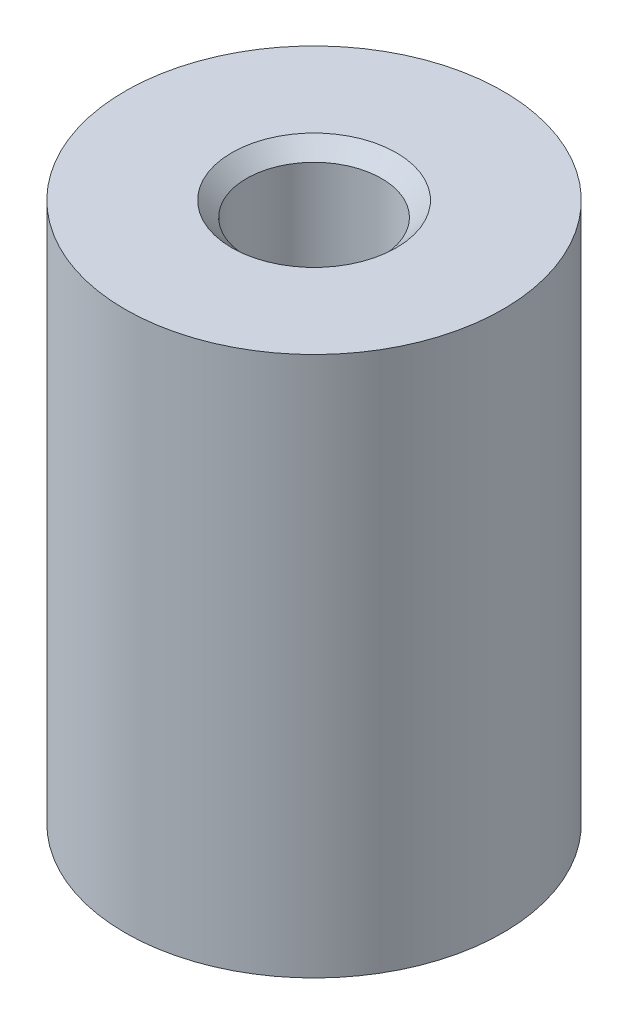
ISO-10303-21;
HEADER;
FILE_DESCRIPTION(('STEP AP214'),'2;1');
FILE_NAME('part.step','',(''),(''),'','','');
FILE_SCHEMA(('AUTOMOTIVE_DESIGN { 1 0 10303 214 1 1 1 1 }'));
ENDSEC;
DATA;
#1=APPLICATION_CONTEXT('core data for automotive mechanical design processes');
#2=APPLICATION_PROTOCOL_DEFINITION('international standard','automotive_design',2000,#1);
#3=PRODUCT_CONTEXT('',#1,'mechanical');
#4=PRODUCT('Part','Part','',(#3));
#5=PRODUCT_RELATED_PRODUCT_CATEGORY('part','',(#4));
#6=PRODUCT_DEFINITION_FORMATION('','',#4);
#7=PRODUCT_DEFINITION_CONTEXT('part definition',#1,'design');
#8=PRODUCT_DEFINITION('design','',#6,#7);
#9=PRODUCT_DEFINITION_SHAPE('','',#8);
#10=(LENGTH_UNIT() NAMED_UNIT(*) SI_UNIT(.MILLI.,.METRE.));
#11=(NAMED_UNIT(*) PLANE_ANGLE_UNIT() SI_UNIT($,.RADIAN.));
#12=(NAMED_UNIT(*) SI_UNIT($,.STERADIAN.) SOLID_ANGLE_UNIT());
#13=UNCERTAINTY_MEASURE_WITH_UNIT(LENGTH_MEASURE(1.E-05),#10,'distance_accuracy_value','');
#14=(GEOMETRIC_REPRESENTATION_CONTEXT(3) GLOBAL_UNCERTAINTY_ASSIGNED_CONTEXT((#13)) GLOBAL_UNIT_ASSIGNED_CONTEXT((#10,
#11,#12)) REPRESENTATION_CONTEXT('',''));
#15=CARTESIAN_POINT('',(0.,0.,0.));
#16=DIRECTION('',(0.,0.,1.));
#17=DIRECTION('',(1.,0.,0.));
#18=AXIS2_PLACEMENT_3D('',#15,#16,#17);
#19=CARTESIAN_POINT('',(-1.86752431277976,10.,0.));
#20=DIRECTION('',(0.,-1.,0.));
#21=DIRECTION('',(0.,0.,-1.));
#22=AXIS2_PLACEMENT_3D('',#19,#20,#21);
#23=CYLINDRICAL_SURFACE('',#22,3.5);
#24=CARTESIAN_POINT('',(-1.86752431277976,10.,0.));
#25=DIRECTION('',(0.,1.,0.));
#26=DIRECTION('',(0.,0.,1.));
#27=AXIS2_PLACEMENT_3D('',#24,#25,#26);
#28=CIRCLE('',#27,3.5);
#29=CARTESIAN_POINT('',(-1.86752431277976,10.,3.5));
#30=VERTEX_POINT('',#29);
#31=EDGE_CURVE('E10',#30,#30,#28,.T.);
#32=ORIENTED_EDGE('',*,*,#31,.F.);
#33=EDGE_LOOP('',(#32));
#34=FACE_BOUND('',#33,.T.);
#35=CARTESIAN_POINT('',(-1.86752431277976,0.,0.));
#36=DIRECTION('',(0.,1.,0.));
#37=DIRECTION('',(0.,0.,1.));
#38=AXIS2_PLACEMENT_3D('',#35,#36,#37);
#39=CIRCLE('',#38,3.5);
#40=CARTESIAN_POINT('',(-1.86752431277976,0.,3.5));
#41=VERTEX_POINT('',#40);
#42=EDGE_CURVE('E36',#41,#41,#39,.T.);
#43=ORIENTED_EDGE('',*,*,#42,.T.);
#44=EDGE_LOOP('',(#43));
#45=FACE_BOUND('',#44,.T.);
#46=ADVANCED_FACE('F33',(#34,#45),#23,.T.);
#47=CARTESIAN_POINT('',(-1.86752431277976,10.,0.));
#48=DIRECTION('',(0.,1.,0.));
#49=DIRECTION('',(0.,0.,1.));
#50=AXIS2_PLACEMENT_3D('',#47,#48,#49);
#51=PLANE('',#50);
#52=CARTESIAN_POINT('',(-1.86752431277976,10.,0.));
#53=DIRECTION('',(0.,1.,0.));
#54=DIRECTION('',(0.,0.,1.));
#55=AXIS2_PLACEMENT_3D('',#52,#53,#54);
#56=CIRCLE('',#55,1.525);
#57=CARTESIAN_POINT('',(-1.86752431277976,10.,1.525));
#58=VERTEX_POINT('',#57);
#59=EDGE_CURVE('E50',#58,#58,#56,.T.);
#60=ORIENTED_EDGE('',*,*,#59,.F.);
#61=EDGE_LOOP('',(#60));
#62=FACE_BOUND('',#61,.T.);
#63=ORIENTED_EDGE('',*,*,#31,.T.);
#64=EDGE_LOOP('',(#63));
#65=FACE_BOUND('',#64,.T.);
#66=ADVANCED_FACE('F56',(#62,#65),#51,.T.);
#67=CARTESIAN_POINT('',(-1.86752431277976,0.,0.));
#68=DIRECTION('',(0.,1.,0.));
#69=DIRECTION('',(0.,0.,1.));
#70=AXIS2_PLACEMENT_3D('',#67,#68,#69);
#71=PLANE('',#70);
#72=CARTESIAN_POINT('',(-1.86752431277976,0.,0.));
#73=DIRECTION('',(0.,1.,0.));
#74=DIRECTION('',(0.,0.,1.));
#75=AXIS2_PLACEMENT_3D('',#72,#73,#74);
#76=CIRCLE('',#75,1.25);
#77=CARTESIAN_POINT('',(-1.86752431277976,0.,1.25));
#78=VERTEX_POINT('',#77);
#79=EDGE_CURVE('E43',#78,#78,#76,.T.);
#80=ORIENTED_EDGE('',*,*,#79,.T.);
#81=EDGE_LOOP('',(#80));
#82=FACE_BOUND('',#81,.T.);
#83=ORIENTED_EDGE('',*,*,#42,.F.);
#84=EDGE_LOOP('',(#83));
#85=FACE_BOUND('',#84,.T.);
#86=ADVANCED_FACE('F58',(#82,#85),#71,.F.);
#87=CARTESIAN_POINT('',(-1.86752431277976,10.,0.));
#88=DIRECTION('',(0.,1.,0.));
#89=DIRECTION('',(0.,0.,1.));
#90=AXIS2_PLACEMENT_3D('',#87,#88,#89);
#91=CYLINDRICAL_SURFACE('',#90,1.25);
#92=ORIENTED_EDGE('',*,*,#79,.F.);
#93=EDGE_LOOP('',(#92));
#94=FACE_BOUND('',#93,.T.);
#95=CARTESIAN_POINT('',(-1.86752431277976,9.725,0.));
#96=DIRECTION('',(0.,1.,0.));
#97=DIRECTION('',(0.,0.,1.));
#98=AXIS2_PLACEMENT_3D('',#95,#96,#97);
#99=CIRCLE('',#98,1.25);
#100=CARTESIAN_POINT('',(-1.86752431277976,9.725,1.25));
#101=VERTEX_POINT('',#100);
#102=EDGE_CURVE('E47',#101,#101,#99,.T.);
#103=ORIENTED_EDGE('',*,*,#102,.T.);
#104=EDGE_LOOP('',(#103));
#105=FACE_BOUND('',#104,.T.);
#106=ADVANCED_FACE('F64',(#94,#105),#91,.F.);
#107=CARTESIAN_POINT('',(-1.86752431277976,10.,0.));
#108=DIRECTION('',(0.,1.,0.));
#109=DIRECTION('',(0.,0.,1.));
#110=AXIS2_PLACEMENT_3D('',#107,#108,#109);
#111=CONICAL_SURFACE('',#110,1.525,0.785398163397449);
#112=ORIENTED_EDGE('',*,*,#102,.F.);
#113=EDGE_LOOP('',(#112));
#114=FACE_BOUND('',#113,.T.);
#115=ORIENTED_EDGE('',*,*,#59,.T.);
#116=EDGE_LOOP('',(#115));
#117=FACE_BOUND('',#116,.T.);
#118=ADVANCED_FACE('F54',(#114,#117),#111,.F.);
#119=CLOSED_SHELL('',(#46,#66,#86,#106,#118));
#120=MANIFOLD_SOLID_BREP('B2',#119);
#121=ADVANCED_BREP_SHAPE_REPRESENTATION('',(#18,#120),#14);
#122=SHAPE_DEFINITION_REPRESENTATION(#9,#121);
ENDSEC;
END-ISO-10303-21;
